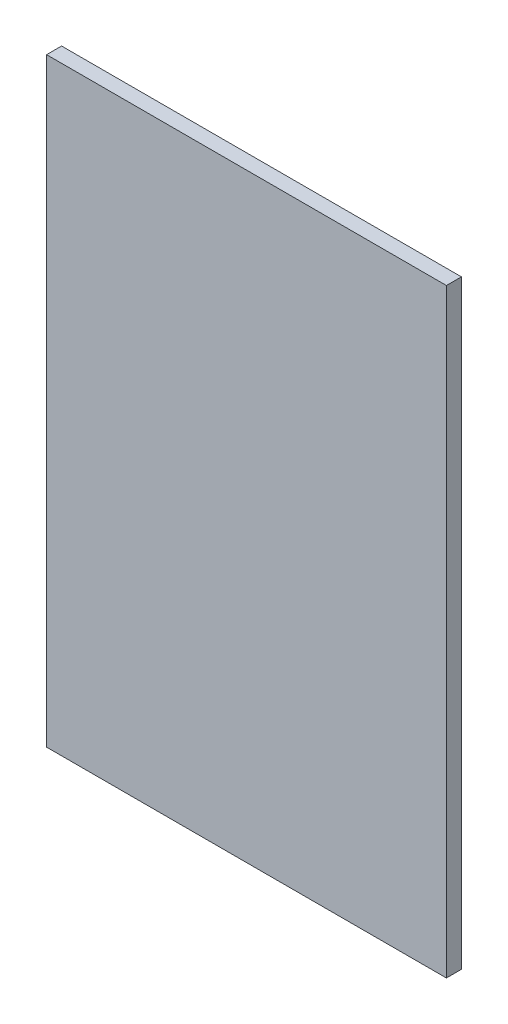
ISO-10303-21;
HEADER;
FILE_DESCRIPTION(('STEP AP214'),'2;1');
FILE_NAME('part.step','',(''),(''),'','','');
FILE_SCHEMA(('AUTOMOTIVE_DESIGN { 1 0 10303 214 1 1 1 1 }'));
ENDSEC;
DATA;
#1=APPLICATION_CONTEXT('core data for automotive mechanical design processes');
#2=APPLICATION_PROTOCOL_DEFINITION('international standard','automotive_design',2000,#1);
#3=PRODUCT_CONTEXT('',#1,'mechanical');
#4=PRODUCT('Part','Part','',(#3));
#5=PRODUCT_RELATED_PRODUCT_CATEGORY('part','',(#4));
#6=PRODUCT_DEFINITION_FORMATION('','',#4);
#7=PRODUCT_DEFINITION_CONTEXT('part definition',#1,'design');
#8=PRODUCT_DEFINITION('design','',#6,#7);
#9=PRODUCT_DEFINITION_SHAPE('','',#8);
#10=(LENGTH_UNIT() NAMED_UNIT(*) SI_UNIT(.MILLI.,.METRE.));
#11=(NAMED_UNIT(*) PLANE_ANGLE_UNIT() SI_UNIT($,.RADIAN.));
#12=(NAMED_UNIT(*) SI_UNIT($,.STERADIAN.) SOLID_ANGLE_UNIT());
#13=UNCERTAINTY_MEASURE_WITH_UNIT(LENGTH_MEASURE(1.E-05),#10,'distance_accuracy_value','');
#14=(GEOMETRIC_REPRESENTATION_CONTEXT(3) GLOBAL_UNCERTAINTY_ASSIGNED_CONTEXT((#13)) GLOBAL_UNIT_ASSIGNED_CONTEXT((#10,
#11,#12)) REPRESENTATION_CONTEXT('',''));
#15=CARTESIAN_POINT('',(0.,0.,0.));
#16=DIRECTION('',(0.,0.,1.));
#17=DIRECTION('',(1.,0.,0.));
#18=AXIS2_PLACEMENT_3D('',#15,#16,#17);
#19=CARTESIAN_POINT('',(200.,-300.,15.));
#20=DIRECTION('',(-1.,0.,0.));
#21=DIRECTION('',(0.,0.,1.));
#22=AXIS2_PLACEMENT_3D('',#19,#20,#21);
#23=PLANE('',#22);
#24=DIRECTION('',(0.,1.,0.));
#25=VECTOR('',#24,1.);
#26=CARTESIAN_POINT('',(200.,-300.,0.));
#27=LINE('',#26,#25);
#28=CARTESIAN_POINT('',(200.,-300.,0.));
#29=VERTEX_POINT('',#28);
#30=CARTESIAN_POINT('',(200.,300.,0.));
#31=VERTEX_POINT('',#30);
#32=EDGE_CURVE('E96',#29,#31,#27,.T.);
#33=ORIENTED_EDGE('',*,*,#32,.T.);
#34=DIRECTION('',(0.,0.,-1.));
#35=VECTOR('',#34,1.);
#36=CARTESIAN_POINT('',(200.,300.,15.));
#37=LINE('',#36,#35);
#38=CARTESIAN_POINT('',(200.,300.,15.));
#39=VERTEX_POINT('',#38);
#40=EDGE_CURVE('E11',#39,#31,#37,.T.);
#41=ORIENTED_EDGE('',*,*,#40,.F.);
#42=DIRECTION('',(0.,1.,0.));
#43=VECTOR('',#42,1.);
#44=CARTESIAN_POINT('',(200.,-300.,15.));
#45=LINE('',#44,#43);
#46=CARTESIAN_POINT('',(200.,-300.,15.));
#47=VERTEX_POINT('',#46);
#48=EDGE_CURVE('E84',#47,#39,#45,.T.);
#49=ORIENTED_EDGE('',*,*,#48,.F.);
#50=DIRECTION('',(0.,0.,-1.));
#51=VECTOR('',#50,1.);
#52=CARTESIAN_POINT('',(200.,-300.,15.));
#53=LINE('',#52,#51);
#54=EDGE_CURVE('E92',#47,#29,#53,.T.);
#55=ORIENTED_EDGE('',*,*,#54,.T.);
#56=EDGE_LOOP('',(#33,#41,#49,#55));
#57=FACE_BOUND('',#56,.T.);
#58=ADVANCED_FACE('F33',(#57),#23,.F.);
#59=CARTESIAN_POINT('',(-200.,300.,15.));
#60=DIRECTION('',(0.,-1.,0.));
#61=DIRECTION('',(0.,0.,-1.));
#62=AXIS2_PLACEMENT_3D('',#59,#60,#61);
#63=PLANE('',#62);
#64=DIRECTION('',(-1.,0.,0.));
#65=VECTOR('',#64,1.);
#66=CARTESIAN_POINT('',(-200.,300.,0.));
#67=LINE('',#66,#65);
#68=CARTESIAN_POINT('',(-200.,300.,0.));
#69=VERTEX_POINT('',#68);
#70=EDGE_CURVE('E88',#31,#69,#67,.T.);
#71=ORIENTED_EDGE('',*,*,#70,.T.);
#72=DIRECTION('',(0.,0.,-1.));
#73=VECTOR('',#72,1.);
#74=CARTESIAN_POINT('',(-200.,300.,15.));
#75=LINE('',#74,#73);
#76=CARTESIAN_POINT('',(-200.,300.,15.));
#77=VERTEX_POINT('',#76);
#78=EDGE_CURVE('E41',#77,#69,#75,.T.);
#79=ORIENTED_EDGE('',*,*,#78,.F.);
#80=DIRECTION('',(-1.,0.,0.));
#81=VECTOR('',#80,1.);
#82=CARTESIAN_POINT('',(-200.,300.,15.));
#83=LINE('',#82,#81);
#84=EDGE_CURVE('E79',#39,#77,#83,.T.);
#85=ORIENTED_EDGE('',*,*,#84,.F.);
#86=ORIENTED_EDGE('',*,*,#40,.T.);
#87=EDGE_LOOP('',(#71,#79,#85,#86));
#88=FACE_BOUND('',#87,.T.);
#89=ADVANCED_FACE('F87',(#88),#63,.F.);
#90=CARTESIAN_POINT('',(-200.,-300.,15.));
#91=DIRECTION('',(1.,0.,0.));
#92=DIRECTION('',(0.,0.,-1.));
#93=AXIS2_PLACEMENT_3D('',#90,#91,#92);
#94=PLANE('',#93);
#95=DIRECTION('',(0.,-1.,0.));
#96=VECTOR('',#95,1.);
#97=CARTESIAN_POINT('',(-200.,-300.,0.));
#98=LINE('',#97,#96);
#99=CARTESIAN_POINT('',(-200.,-300.,0.));
#100=VERTEX_POINT('',#99);
#101=EDGE_CURVE('E66',#69,#100,#98,.T.);
#102=ORIENTED_EDGE('',*,*,#101,.T.);
#103=DIRECTION('',(0.,0.,-1.));
#104=VECTOR('',#103,1.);
#105=CARTESIAN_POINT('',(-200.,-300.,15.));
#106=LINE('',#105,#104);
#107=CARTESIAN_POINT('',(-200.,-300.,15.));
#108=VERTEX_POINT('',#107);
#109=EDGE_CURVE('E89',#108,#100,#106,.T.);
#110=ORIENTED_EDGE('',*,*,#109,.F.);
#111=DIRECTION('',(0.,-1.,0.));
#112=VECTOR('',#111,1.);
#113=CARTESIAN_POINT('',(-200.,-300.,15.));
#114=LINE('',#113,#112);
#115=EDGE_CURVE('E82',#77,#108,#114,.T.);
#116=ORIENTED_EDGE('',*,*,#115,.F.);
#117=ORIENTED_EDGE('',*,*,#78,.T.);
#118=EDGE_LOOP('',(#102,#110,#116,#117));
#119=FACE_BOUND('',#118,.T.);
#120=ADVANCED_FACE('F90',(#119),#94,.F.);
#121=CARTESIAN_POINT('',(-200.,-300.,15.));
#122=DIRECTION('',(0.,1.,0.));
#123=DIRECTION('',(0.,0.,1.));
#124=AXIS2_PLACEMENT_3D('',#121,#122,#123);
#125=PLANE('',#124);
#126=DIRECTION('',(1.,0.,0.));
#127=VECTOR('',#126,1.);
#128=CARTESIAN_POINT('',(-200.,-300.,0.));
#129=LINE('',#128,#127);
#130=EDGE_CURVE('E72',#100,#29,#129,.T.);
#131=ORIENTED_EDGE('',*,*,#130,.T.);
#132=ORIENTED_EDGE('',*,*,#54,.F.);
#133=DIRECTION('',(1.,0.,0.));
#134=VECTOR('',#133,1.);
#135=CARTESIAN_POINT('',(-200.,-300.,15.));
#136=LINE('',#135,#134);
#137=EDGE_CURVE('E49',#108,#47,#136,.T.);
#138=ORIENTED_EDGE('',*,*,#137,.F.);
#139=ORIENTED_EDGE('',*,*,#109,.T.);
#140=EDGE_LOOP('',(#131,#132,#138,#139));
#141=FACE_BOUND('',#140,.T.);
#142=ADVANCED_FACE('F103',(#141),#125,.F.);
#143=CARTESIAN_POINT('',(0.,0.,15.));
#144=DIRECTION('',(0.,0.,-1.));
#145=DIRECTION('',(-1.,0.,0.));
#146=AXIS2_PLACEMENT_3D('',#143,#144,#145);
#147=PLANE('',#146);
#148=ORIENTED_EDGE('',*,*,#48,.T.);
#149=ORIENTED_EDGE('',*,*,#84,.T.);
#150=ORIENTED_EDGE('',*,*,#115,.T.);
#151=ORIENTED_EDGE('',*,*,#137,.T.);
#152=EDGE_LOOP('',(#148,#149,#150,#151));
#153=FACE_BOUND('',#152,.T.);
#154=ADVANCED_FACE('F80',(#153),#147,.F.);
#155=CARTESIAN_POINT('',(0.,0.,0.));
#156=DIRECTION('',(0.,0.,-1.));
#157=DIRECTION('',(-1.,0.,0.));
#158=AXIS2_PLACEMENT_3D('',#155,#156,#157);
#159=PLANE('',#158);
#160=ORIENTED_EDGE('',*,*,#32,.F.);
#161=ORIENTED_EDGE('',*,*,#130,.F.);
#162=ORIENTED_EDGE('',*,*,#101,.F.);
#163=ORIENTED_EDGE('',*,*,#70,.F.);
#164=EDGE_LOOP('',(#160,#161,#162,#163));
#165=FACE_BOUND('',#164,.T.);
#166=ADVANCED_FACE('F106',(#165),#159,.T.);
#167=CLOSED_SHELL('',(#58,#89,#120,#142,#154,#166));
#168=MANIFOLD_SOLID_BREP('B2',#167);
#169=ADVANCED_BREP_SHAPE_REPRESENTATION('',(#18,#168),#14);
#170=SHAPE_DEFINITION_REPRESENTATION(#9,#169);
ENDSEC;
END-ISO-10303-21;
